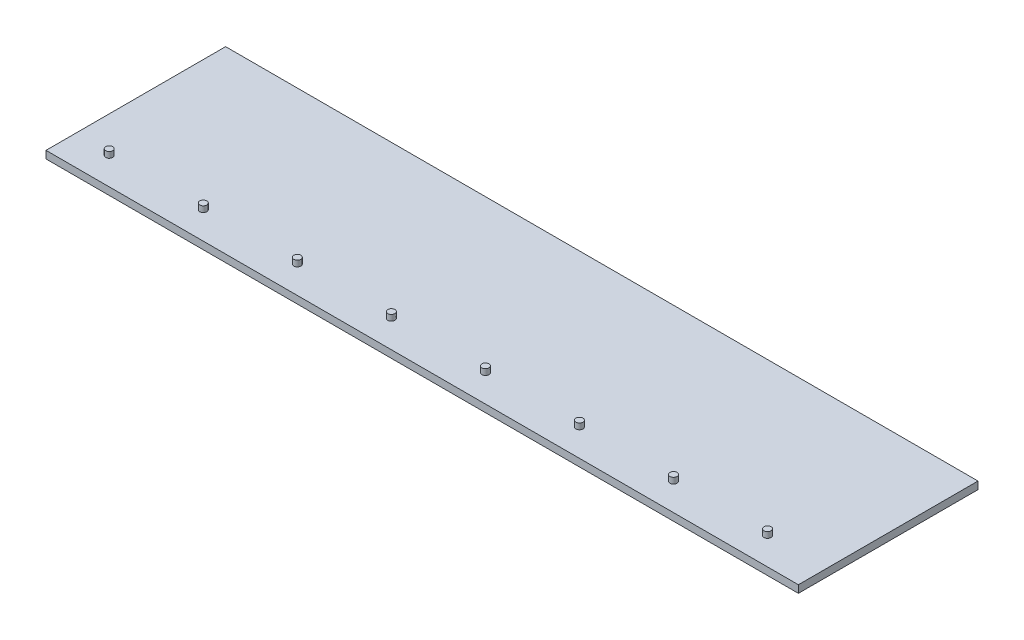
ISO-10303-21;
HEADER;
FILE_DESCRIPTION(('STEP AP214'),'2;1');
FILE_NAME('part.step','',(''),(''),'','','');
FILE_SCHEMA(('AUTOMOTIVE_DESIGN { 1 0 10303 214 1 1 1 1 }'));
ENDSEC;
DATA;
#1=APPLICATION_CONTEXT('core data for automotive mechanical design processes');
#2=APPLICATION_PROTOCOL_DEFINITION('international standard','automotive_design',2000,#1);
#3=PRODUCT_CONTEXT('',#1,'mechanical');
#4=PRODUCT('Part','Part','',(#3));
#5=PRODUCT_RELATED_PRODUCT_CATEGORY('part','',(#4));
#6=PRODUCT_DEFINITION_FORMATION('','',#4);
#7=PRODUCT_DEFINITION_CONTEXT('part definition',#1,'design');
#8=PRODUCT_DEFINITION('design','',#6,#7);
#9=PRODUCT_DEFINITION_SHAPE('','',#8);
#10=(LENGTH_UNIT() NAMED_UNIT(*) SI_UNIT(.MILLI.,.METRE.));
#11=(NAMED_UNIT(*) PLANE_ANGLE_UNIT() SI_UNIT($,.RADIAN.));
#12=(NAMED_UNIT(*) SI_UNIT($,.STERADIAN.) SOLID_ANGLE_UNIT());
#13=UNCERTAINTY_MEASURE_WITH_UNIT(LENGTH_MEASURE(1.E-05),#10,'distance_accuracy_value','');
#14=(GEOMETRIC_REPRESENTATION_CONTEXT(3) GLOBAL_UNCERTAINTY_ASSIGNED_CONTEXT((#13)) GLOBAL_UNIT_ASSIGNED_CONTEXT((#10,
#11,#12)) REPRESENTATION_CONTEXT('',''));
#15=CARTESIAN_POINT('',(0.,0.,0.));
#16=DIRECTION('',(0.,0.,1.));
#17=DIRECTION('',(1.,0.,0.));
#18=AXIS2_PLACEMENT_3D('',#15,#16,#17);
#19=CARTESIAN_POINT('',(147.284433720714,2.8321,-5.77122017290323));
#20=DIRECTION('',(0.,1.,0.));
#21=DIRECTION('',(0.,0.,1.));
#22=AXIS2_PLACEMENT_3D('',#19,#20,#21);
#23=PLANE('',#22);
#24=CARTESIAN_POINT('',(147.284433720714,2.8321,-5.77122017290323));
#25=DIRECTION('',(0.,1.,0.));
#26=DIRECTION('',(0.,0.,1.));
#27=AXIS2_PLACEMENT_3D('',#24,#25,#26);
#28=CIRCLE('',#27,0.75);
#29=CARTESIAN_POINT('',(147.284433720714,2.8321,-5.02122017290323));
#30=VERTEX_POINT('',#29);
#31=EDGE_CURVE('E11',#30,#30,#28,.T.);
#32=ORIENTED_EDGE('',*,*,#31,.T.);
#33=EDGE_LOOP('',(#32));
#34=FACE_BOUND('',#33,.T.);
#35=ADVANCED_FACE('F39',(#34),#23,.T.);
#36=CARTESIAN_POINT('',(147.284433720714,2.8321,-5.77122017290323));
#37=DIRECTION('',(0.,-1.,0.));
#38=DIRECTION('',(0.,0.,-1.));
#39=AXIS2_PLACEMENT_3D('',#36,#37,#38);
#40=CYLINDRICAL_SURFACE('',#39,0.75);
#41=ORIENTED_EDGE('',*,*,#31,.F.);
#42=EDGE_LOOP('',(#41));
#43=FACE_BOUND('',#42,.T.);
#44=CARTESIAN_POINT('',(147.284433720714,1.5875,-5.77122017290323));
#45=DIRECTION('',(0.,-1.,0.));
#46=DIRECTION('',(0.,0.,-1.));
#47=AXIS2_PLACEMENT_3D('',#44,#45,#46);
#48=CIRCLE('',#47,0.75);
#49=CARTESIAN_POINT('',(147.284433720714,1.5875,-6.52122017290323));
#50=VERTEX_POINT('',#49);
#51=EDGE_CURVE('E48',#50,#50,#48,.F.);
#52=ORIENTED_EDGE('',*,*,#51,.T.);
#53=EDGE_LOOP('',(#52));
#54=FACE_BOUND('',#53,.T.);
#55=ADVANCED_FACE('F180',(#43,#54),#40,.T.);
#56=CARTESIAN_POINT('',(127.335320370419,2.8321,-5.77122017290323));
#57=DIRECTION('',(0.,1.,0.));
#58=DIRECTION('',(0.,0.,1.));
#59=AXIS2_PLACEMENT_3D('',#56,#57,#58);
#60=PLANE('',#59);
#61=CARTESIAN_POINT('',(127.335320370419,2.8321,-5.77122017290323));
#62=DIRECTION('',(0.,1.,0.));
#63=DIRECTION('',(0.,0.,1.));
#64=AXIS2_PLACEMENT_3D('',#61,#62,#63);
#65=CIRCLE('',#64,0.75);
#66=CARTESIAN_POINT('',(127.335320370419,2.8321,-5.02122017290323));
#67=VERTEX_POINT('',#66);
#68=EDGE_CURVE('E173',#67,#67,#65,.T.);
#69=ORIENTED_EDGE('',*,*,#68,.T.);
#70=EDGE_LOOP('',(#69));
#71=FACE_BOUND('',#70,.T.);
#72=ADVANCED_FACE('F203',(#71),#60,.T.);
#73=CARTESIAN_POINT('',(127.335320370419,2.8321,-5.77122017290323));
#74=DIRECTION('',(0.,-1.,0.));
#75=DIRECTION('',(0.,0.,-1.));
#76=AXIS2_PLACEMENT_3D('',#73,#74,#75);
#77=CYLINDRICAL_SURFACE('',#76,0.75);
#78=ORIENTED_EDGE('',*,*,#68,.F.);
#79=EDGE_LOOP('',(#78));
#80=FACE_BOUND('',#79,.T.);
#81=CARTESIAN_POINT('',(127.335320370419,1.5875,-5.77122017290323));
#82=DIRECTION('',(0.,-1.,0.));
#83=DIRECTION('',(0.,0.,-1.));
#84=AXIS2_PLACEMENT_3D('',#81,#82,#83);
#85=CIRCLE('',#84,0.75);
#86=CARTESIAN_POINT('',(127.335320370419,1.5875,-6.52122017290323));
#87=VERTEX_POINT('',#86);
#88=EDGE_CURVE('E169',#87,#87,#85,.F.);
#89=ORIENTED_EDGE('',*,*,#88,.T.);
#90=EDGE_LOOP('',(#89));
#91=FACE_BOUND('',#90,.T.);
#92=ADVANCED_FACE('F209',(#80,#91),#77,.T.);
#93=CARTESIAN_POINT('',(107.386207020124,2.8321,-5.77122017290323));
#94=DIRECTION('',(0.,1.,0.));
#95=DIRECTION('',(0.,0.,1.));
#96=AXIS2_PLACEMENT_3D('',#93,#94,#95);
#97=PLANE('',#96);
#98=CARTESIAN_POINT('',(107.386207020124,2.8321,-5.77122017290323));
#99=DIRECTION('',(0.,1.,0.));
#100=DIRECTION('',(0.,0.,1.));
#101=AXIS2_PLACEMENT_3D('',#98,#99,#100);
#102=CIRCLE('',#101,0.75);
#103=CARTESIAN_POINT('',(107.386207020124,2.8321,-5.02122017290323));
#104=VERTEX_POINT('',#103);
#105=EDGE_CURVE('E165',#104,#104,#102,.T.);
#106=ORIENTED_EDGE('',*,*,#105,.T.);
#107=EDGE_LOOP('',(#106));
#108=FACE_BOUND('',#107,.T.);
#109=ADVANCED_FACE('F215',(#108),#97,.T.);
#110=CARTESIAN_POINT('',(107.386207020124,2.8321,-5.77122017290323));
#111=DIRECTION('',(0.,-1.,0.));
#112=DIRECTION('',(0.,0.,-1.));
#113=AXIS2_PLACEMENT_3D('',#110,#111,#112);
#114=CYLINDRICAL_SURFACE('',#113,0.75);
#115=ORIENTED_EDGE('',*,*,#105,.F.);
#116=EDGE_LOOP('',(#115));
#117=FACE_BOUND('',#116,.T.);
#118=CARTESIAN_POINT('',(107.386207020124,1.5875,-5.77122017290323));
#119=DIRECTION('',(0.,-1.,0.));
#120=DIRECTION('',(0.,0.,-1.));
#121=AXIS2_PLACEMENT_3D('',#118,#119,#120);
#122=CIRCLE('',#121,0.75);
#123=CARTESIAN_POINT('',(107.386207020124,1.5875,-6.52122017290323));
#124=VERTEX_POINT('',#123);
#125=EDGE_CURVE('E161',#124,#124,#122,.F.);
#126=ORIENTED_EDGE('',*,*,#125,.T.);
#127=EDGE_LOOP('',(#126));
#128=FACE_BOUND('',#127,.T.);
#129=ADVANCED_FACE('F219',(#117,#128),#114,.T.);
#130=CARTESIAN_POINT('',(87.4370936698287,2.8321,-5.77122017290323));
#131=DIRECTION('',(0.,1.,0.));
#132=DIRECTION('',(0.,0.,1.));
#133=AXIS2_PLACEMENT_3D('',#130,#131,#132);
#134=PLANE('',#133);
#135=CARTESIAN_POINT('',(87.4370936698287,2.8321,-5.77122017290323));
#136=DIRECTION('',(0.,1.,0.));
#137=DIRECTION('',(0.,0.,1.));
#138=AXIS2_PLACEMENT_3D('',#135,#136,#137);
#139=CIRCLE('',#138,0.75);
#140=CARTESIAN_POINT('',(87.4370936698287,2.8321,-5.02122017290323));
#141=VERTEX_POINT('',#140);
#142=EDGE_CURVE('E157',#141,#141,#139,.T.);
#143=ORIENTED_EDGE('',*,*,#142,.T.);
#144=EDGE_LOOP('',(#143));
#145=FACE_BOUND('',#144,.T.);
#146=ADVANCED_FACE('F223',(#145),#134,.T.);
#147=CARTESIAN_POINT('',(87.4370936698287,2.8321,-5.77122017290323));
#148=DIRECTION('',(0.,-1.,0.));
#149=DIRECTION('',(0.,0.,-1.));
#150=AXIS2_PLACEMENT_3D('',#147,#148,#149);
#151=CYLINDRICAL_SURFACE('',#150,0.75);
#152=ORIENTED_EDGE('',*,*,#142,.F.);
#153=EDGE_LOOP('',(#152));
#154=FACE_BOUND('',#153,.T.);
#155=CARTESIAN_POINT('',(87.4370936698287,1.5875,-5.77122017290323));
#156=DIRECTION('',(0.,-1.,0.));
#157=DIRECTION('',(0.,0.,-1.));
#158=AXIS2_PLACEMENT_3D('',#155,#156,#157);
#159=CIRCLE('',#158,0.75);
#160=CARTESIAN_POINT('',(87.4370936698287,1.5875,-6.52122017290323));
#161=VERTEX_POINT('',#160);
#162=EDGE_CURVE('E153',#161,#161,#159,.F.);
#163=ORIENTED_EDGE('',*,*,#162,.T.);
#164=EDGE_LOOP('',(#163));
#165=FACE_BOUND('',#164,.T.);
#166=ADVANCED_FACE('F227',(#154,#165),#151,.T.);
#167=CARTESIAN_POINT('',(67.4879803195335,2.8321,-5.77122017290323));
#168=DIRECTION('',(0.,1.,0.));
#169=DIRECTION('',(0.,0.,1.));
#170=AXIS2_PLACEMENT_3D('',#167,#168,#169);
#171=PLANE('',#170);
#172=CARTESIAN_POINT('',(67.4879803195335,2.8321,-5.77122017290323));
#173=DIRECTION('',(0.,1.,0.));
#174=DIRECTION('',(0.,0.,1.));
#175=AXIS2_PLACEMENT_3D('',#172,#173,#174);
#176=CIRCLE('',#175,0.75);
#177=CARTESIAN_POINT('',(67.4879803195335,2.8321,-5.02122017290323));
#178=VERTEX_POINT('',#177);
#179=EDGE_CURVE('E149',#178,#178,#176,.T.);
#180=ORIENTED_EDGE('',*,*,#179,.T.);
#181=EDGE_LOOP('',(#180));
#182=FACE_BOUND('',#181,.T.);
#183=ADVANCED_FACE('F231',(#182),#171,.T.);
#184=CARTESIAN_POINT('',(67.4879803195335,2.8321,-5.77122017290323));
#185=DIRECTION('',(0.,-1.,0.));
#186=DIRECTION('',(0.,0.,-1.));
#187=AXIS2_PLACEMENT_3D('',#184,#185,#186);
#188=CYLINDRICAL_SURFACE('',#187,0.75);
#189=ORIENTED_EDGE('',*,*,#179,.F.);
#190=EDGE_LOOP('',(#189));
#191=FACE_BOUND('',#190,.T.);
#192=CARTESIAN_POINT('',(67.4879803195335,1.5875,-5.77122017290323));
#193=DIRECTION('',(0.,-1.,0.));
#194=DIRECTION('',(0.,0.,-1.));
#195=AXIS2_PLACEMENT_3D('',#192,#193,#194);
#196=CIRCLE('',#195,0.75);
#197=CARTESIAN_POINT('',(67.4879803195335,1.5875,-6.52122017290323));
#198=VERTEX_POINT('',#197);
#199=EDGE_CURVE('E145',#198,#198,#196,.F.);
#200=ORIENTED_EDGE('',*,*,#199,.T.);
#201=EDGE_LOOP('',(#200));
#202=FACE_BOUND('',#201,.T.);
#203=ADVANCED_FACE('F235',(#191,#202),#188,.T.);
#204=CARTESIAN_POINT('',(47.5388669692384,2.8321,-5.77122017290323));
#205=DIRECTION('',(0.,1.,0.));
#206=DIRECTION('',(0.,0.,1.));
#207=AXIS2_PLACEMENT_3D('',#204,#205,#206);
#208=PLANE('',#207);
#209=CARTESIAN_POINT('',(47.5388669692384,2.8321,-5.77122017290323));
#210=DIRECTION('',(0.,1.,0.));
#211=DIRECTION('',(0.,0.,1.));
#212=AXIS2_PLACEMENT_3D('',#209,#210,#211);
#213=CIRCLE('',#212,0.75);
#214=CARTESIAN_POINT('',(47.5388669692384,2.8321,-5.02122017290323));
#215=VERTEX_POINT('',#214);
#216=EDGE_CURVE('E141',#215,#215,#213,.T.);
#217=ORIENTED_EDGE('',*,*,#216,.T.);
#218=EDGE_LOOP('',(#217));
#219=FACE_BOUND('',#218,.T.);
#220=ADVANCED_FACE('F239',(#219),#208,.T.);
#221=CARTESIAN_POINT('',(47.5388669692384,2.8321,-5.77122017290323));
#222=DIRECTION('',(0.,-1.,0.));
#223=DIRECTION('',(0.,0.,-1.));
#224=AXIS2_PLACEMENT_3D('',#221,#222,#223);
#225=CYLINDRICAL_SURFACE('',#224,0.75);
#226=ORIENTED_EDGE('',*,*,#216,.F.);
#227=EDGE_LOOP('',(#226));
#228=FACE_BOUND('',#227,.T.);
#229=CARTESIAN_POINT('',(47.5388669692384,1.5875,-5.77122017290323));
#230=DIRECTION('',(0.,-1.,0.));
#231=DIRECTION('',(0.,0.,-1.));
#232=AXIS2_PLACEMENT_3D('',#229,#230,#231);
#233=CIRCLE('',#232,0.75);
#234=CARTESIAN_POINT('',(47.5388669692384,1.5875,-6.52122017290323));
#235=VERTEX_POINT('',#234);
#236=EDGE_CURVE('E137',#235,#235,#233,.F.);
#237=ORIENTED_EDGE('',*,*,#236,.T.);
#238=EDGE_LOOP('',(#237));
#239=FACE_BOUND('',#238,.T.);
#240=ADVANCED_FACE('F243',(#228,#239),#225,.T.);
#241=CARTESIAN_POINT('',(0.,1.5875,0.));
#242=DIRECTION('',(1.,0.,0.));
#243=DIRECTION('',(0.,0.,-1.));
#244=AXIS2_PLACEMENT_3D('',#241,#242,#243);
#245=PLANE('',#244);
#246=DIRECTION('',(0.,0.,1.));
#247=VECTOR('',#246,1.);
#248=CARTESIAN_POINT('',(0.,0.,0.));
#249=LINE('',#248,#247);
#250=CARTESIAN_POINT('',(0.,0.,-38.1));
#251=VERTEX_POINT('',#250);
#252=CARTESIAN_POINT('',(0.,0.,0.));
#253=VERTEX_POINT('',#252);
#254=EDGE_CURVE('E112',#251,#253,#249,.T.);
#255=ORIENTED_EDGE('',*,*,#254,.T.);
#256=DIRECTION('',(0.,-1.,0.));
#257=VECTOR('',#256,1.);
#258=CARTESIAN_POINT('',(0.,1.5875,0.));
#259=LINE('',#258,#257);
#260=CARTESIAN_POINT('',(0.,1.5875,0.));
#261=VERTEX_POINT('',#260);
#262=EDGE_CURVE('E101',#261,#253,#259,.T.);
#263=ORIENTED_EDGE('',*,*,#262,.F.);
#264=DIRECTION('',(0.,0.,1.));
#265=VECTOR('',#264,1.);
#266=CARTESIAN_POINT('',(0.,1.5875,0.));
#267=LINE('',#266,#265);
#268=CARTESIAN_POINT('',(0.,1.5875,-38.1));
#269=VERTEX_POINT('',#268);
#270=EDGE_CURVE('E93',#269,#261,#267,.T.);
#271=ORIENTED_EDGE('',*,*,#270,.F.);
#272=DIRECTION('',(0.,-1.,0.));
#273=VECTOR('',#272,1.);
#274=CARTESIAN_POINT('',(0.,1.5875,-38.1));
#275=LINE('',#274,#273);
#276=EDGE_CURVE('E108',#269,#251,#275,.T.);
#277=ORIENTED_EDGE('',*,*,#276,.T.);
#278=EDGE_LOOP('',(#255,#263,#271,#277));
#279=FACE_BOUND('',#278,.T.);
#280=ADVANCED_FACE('F247',(#279),#245,.F.);
#281=CARTESIAN_POINT('',(0.,1.5875,0.));
#282=DIRECTION('',(0.,0.,-1.));
#283=DIRECTION('',(-1.,0.,0.));
#284=AXIS2_PLACEMENT_3D('',#281,#282,#283);
#285=PLANE('',#284);
#286=DIRECTION('',(1.,0.,0.));
#287=VECTOR('',#286,1.);
#288=CARTESIAN_POINT('',(0.,0.,0.));
#289=LINE('',#288,#287);
#290=CARTESIAN_POINT('',(159.592906802361,0.,0.));
#291=VERTEX_POINT('',#290);
#292=EDGE_CURVE('E99',#253,#291,#289,.T.);
#293=ORIENTED_EDGE('',*,*,#292,.T.);
#294=DIRECTION('',(0.,-1.,0.));
#295=VECTOR('',#294,1.);
#296=CARTESIAN_POINT('',(159.592906802361,1.5875,0.));
#297=LINE('',#296,#295);
#298=CARTESIAN_POINT('',(159.592906802361,1.5875,0.));
#299=VERTEX_POINT('',#298);
#300=EDGE_CURVE('E97',#299,#291,#297,.T.);
#301=ORIENTED_EDGE('',*,*,#300,.F.);
#302=DIRECTION('',(1.,0.,0.));
#303=VECTOR('',#302,1.);
#304=CARTESIAN_POINT('',(0.,1.5875,0.));
#305=LINE('',#304,#303);
#306=EDGE_CURVE('E87',#261,#299,#305,.T.);
#307=ORIENTED_EDGE('',*,*,#306,.F.);
#308=ORIENTED_EDGE('',*,*,#262,.T.);
#309=EDGE_LOOP('',(#293,#301,#307,#308));
#310=FACE_BOUND('',#309,.T.);
#311=ADVANCED_FACE('F98',(#310),#285,.F.);
#312=CARTESIAN_POINT('',(159.592906802361,1.5875,0.));
#313=DIRECTION('',(-1.,0.,0.));
#314=DIRECTION('',(0.,0.,1.));
#315=AXIS2_PLACEMENT_3D('',#312,#313,#314);
#316=PLANE('',#315);
#317=DIRECTION('',(0.,0.,-1.));
#318=VECTOR('',#317,1.);
#319=CARTESIAN_POINT('',(159.592906802361,0.,0.));
#320=LINE('',#319,#318);
#321=CARTESIAN_POINT('',(159.592906802361,0.,-38.1));
#322=VERTEX_POINT('',#321);
#323=EDGE_CURVE('E73',#291,#322,#320,.T.);
#324=ORIENTED_EDGE('',*,*,#323,.T.);
#325=DIRECTION('',(0.,-1.,0.));
#326=VECTOR('',#325,1.);
#327=CARTESIAN_POINT('',(159.592906802361,1.5875,-38.1));
#328=LINE('',#327,#326);
#329=CARTESIAN_POINT('',(159.592906802361,1.5875,-38.1));
#330=VERTEX_POINT('',#329);
#331=EDGE_CURVE('E102',#330,#322,#328,.T.);
#332=ORIENTED_EDGE('',*,*,#331,.F.);
#333=DIRECTION('',(0.,0.,-1.));
#334=VECTOR('',#333,1.);
#335=CARTESIAN_POINT('',(159.592906802361,1.5875,0.));
#336=LINE('',#335,#334);
#337=EDGE_CURVE('E91',#299,#330,#336,.T.);
#338=ORIENTED_EDGE('',*,*,#337,.F.);
#339=ORIENTED_EDGE('',*,*,#300,.T.);
#340=EDGE_LOOP('',(#324,#332,#338,#339));
#341=FACE_BOUND('',#340,.T.);
#342=ADVANCED_FACE('F104',(#341),#316,.F.);
#343=CARTESIAN_POINT('',(0.,1.5875,-38.1));
#344=DIRECTION('',(0.,0.,1.));
#345=DIRECTION('',(1.,0.,0.));
#346=AXIS2_PLACEMENT_3D('',#343,#344,#345);
#347=PLANE('',#346);
#348=DIRECTION('',(-1.,0.,0.));
#349=VECTOR('',#348,1.);
#350=CARTESIAN_POINT('',(0.,0.,-38.1));
#351=LINE('',#350,#349);
#352=EDGE_CURVE('E79',#322,#251,#351,.T.);
#353=ORIENTED_EDGE('',*,*,#352,.T.);
#354=ORIENTED_EDGE('',*,*,#276,.F.);
#355=DIRECTION('',(-1.,0.,0.));
#356=VECTOR('',#355,1.);
#357=CARTESIAN_POINT('',(0.,1.5875,-38.1));
#358=LINE('',#357,#356);
#359=EDGE_CURVE('E56',#330,#269,#358,.T.);
#360=ORIENTED_EDGE('',*,*,#359,.F.);
#361=ORIENTED_EDGE('',*,*,#331,.T.);
#362=EDGE_LOOP('',(#353,#354,#360,#361));
#363=FACE_BOUND('',#362,.T.);
#364=ADVANCED_FACE('F184',(#363),#347,.F.);
#365=CARTESIAN_POINT('',(0.,1.5875,0.));
#366=DIRECTION('',(0.,-1.,0.));
#367=DIRECTION('',(0.,0.,-1.));
#368=AXIS2_PLACEMENT_3D('',#365,#366,#367);
#369=PLANE('',#368);
#370=CARTESIAN_POINT('',(27.5897536189432,1.5875,-5.77122017290323));
#371=DIRECTION('',(0.,-1.,0.));
#372=DIRECTION('',(0.,0.,-1.));
#373=AXIS2_PLACEMENT_3D('',#370,#371,#372);
#374=CIRCLE('',#373,0.75);
#375=CARTESIAN_POINT('',(27.5897536189432,1.5875,-6.52122017290323));
#376=VERTEX_POINT('',#375);
#377=EDGE_CURVE('E133',#376,#376,#374,.F.);
#378=ORIENTED_EDGE('',*,*,#377,.F.);
#379=EDGE_LOOP('',(#378));
#380=FACE_BOUND('',#379,.T.);
#381=CARTESIAN_POINT('',(7.64064026864799,1.5875,-5.77122017290323));
#382=DIRECTION('',(0.,-1.,0.));
#383=DIRECTION('',(0.,0.,-1.));
#384=AXIS2_PLACEMENT_3D('',#381,#382,#383);
#385=CIRCLE('',#384,0.75);
#386=CARTESIAN_POINT('',(7.64064026864799,1.5875,-6.52122017290323));
#387=VERTEX_POINT('',#386);
#388=EDGE_CURVE('E129',#387,#387,#385,.F.);
#389=ORIENTED_EDGE('',*,*,#388,.F.);
#390=EDGE_LOOP('',(#389));
#391=FACE_BOUND('',#390,.T.);
#392=ORIENTED_EDGE('',*,*,#270,.T.);
#393=ORIENTED_EDGE('',*,*,#306,.T.);
#394=ORIENTED_EDGE('',*,*,#337,.T.);
#395=ORIENTED_EDGE('',*,*,#359,.T.);
#396=EDGE_LOOP('',(#392,#393,#394,#395));
#397=FACE_BOUND('',#396,.T.);
#398=ORIENTED_EDGE('',*,*,#236,.F.);
#399=EDGE_LOOP('',(#398));
#400=FACE_BOUND('',#399,.T.);
#401=ORIENTED_EDGE('',*,*,#199,.F.);
#402=EDGE_LOOP('',(#401));
#403=FACE_BOUND('',#402,.T.);
#404=ORIENTED_EDGE('',*,*,#162,.F.);
#405=EDGE_LOOP('',(#404));
#406=FACE_BOUND('',#405,.T.);
#407=ORIENTED_EDGE('',*,*,#125,.F.);
#408=EDGE_LOOP('',(#407));
#409=FACE_BOUND('',#408,.T.);
#410=ORIENTED_EDGE('',*,*,#88,.F.);
#411=EDGE_LOOP('',(#410));
#412=FACE_BOUND('',#411,.T.);
#413=ORIENTED_EDGE('',*,*,#51,.F.);
#414=EDGE_LOOP('',(#413));
#415=FACE_BOUND('',#414,.T.);
#416=ADVANCED_FACE('F88',(#380,#391,#397,#400,#403,#406,#409,#412,#415),#369,.F.);
#417=CARTESIAN_POINT('',(0.,0.,0.));
#418=DIRECTION('',(0.,-1.,0.));
#419=DIRECTION('',(0.,0.,-1.));
#420=AXIS2_PLACEMENT_3D('',#417,#418,#419);
#421=PLANE('',#420);
#422=ORIENTED_EDGE('',*,*,#254,.F.);
#423=ORIENTED_EDGE('',*,*,#352,.F.);
#424=ORIENTED_EDGE('',*,*,#323,.F.);
#425=ORIENTED_EDGE('',*,*,#292,.F.);
#426=EDGE_LOOP('',(#422,#423,#424,#425));
#427=FACE_BOUND('',#426,.T.);
#428=ADVANCED_FACE('F183',(#427),#421,.T.);
#429=CARTESIAN_POINT('',(7.64064026864799,2.8321,-5.77122017290323));
#430=DIRECTION('',(0.,-1.,0.));
#431=DIRECTION('',(0.,0.,-1.));
#432=AXIS2_PLACEMENT_3D('',#429,#430,#431);
#433=CYLINDRICAL_SURFACE('',#432,0.75);
#434=CARTESIAN_POINT('',(7.64064026864799,2.8321,-5.77122017290323));
#435=DIRECTION('',(0.,1.,0.));
#436=DIRECTION('',(0.,0.,1.));
#437=AXIS2_PLACEMENT_3D('',#434,#435,#436);
#438=CIRCLE('',#437,0.75);
#439=CARTESIAN_POINT('',(7.64064026864799,2.8321,-5.02122017290323));
#440=VERTEX_POINT('',#439);
#441=EDGE_CURVE('E116',#440,#440,#438,.T.);
#442=ORIENTED_EDGE('',*,*,#441,.F.);
#443=EDGE_LOOP('',(#442));
#444=FACE_BOUND('',#443,.T.);
#445=ORIENTED_EDGE('',*,*,#388,.T.);
#446=EDGE_LOOP('',(#445));
#447=FACE_BOUND('',#446,.T.);
#448=ADVANCED_FACE('F191',(#444,#447),#433,.T.);
#449=CARTESIAN_POINT('',(7.64064026864799,2.8321,-5.77122017290323));
#450=DIRECTION('',(0.,1.,0.));
#451=DIRECTION('',(0.,0.,1.));
#452=AXIS2_PLACEMENT_3D('',#449,#450,#451);
#453=PLANE('',#452);
#454=ORIENTED_EDGE('',*,*,#441,.T.);
#455=EDGE_LOOP('',(#454));
#456=FACE_BOUND('',#455,.T.);
#457=ADVANCED_FACE('F279',(#456),#453,.T.);
#458=CARTESIAN_POINT('',(27.5897536189432,2.8321,-5.77122017290323));
#459=DIRECTION('',(0.,-1.,0.));
#460=DIRECTION('',(0.,0.,-1.));
#461=AXIS2_PLACEMENT_3D('',#458,#459,#460);
#462=CYLINDRICAL_SURFACE('',#461,0.75);
#463=CARTESIAN_POINT('',(27.5897536189432,2.8321,-5.77122017290323));
#464=DIRECTION('',(0.,1.,0.));
#465=DIRECTION('',(0.,0.,1.));
#466=AXIS2_PLACEMENT_3D('',#463,#464,#465);
#467=CIRCLE('',#466,0.75);
#468=CARTESIAN_POINT('',(27.5897536189432,2.8321,-5.02122017290323));
#469=VERTEX_POINT('',#468);
#470=EDGE_CURVE('E385',#469,#469,#467,.T.);
#471=ORIENTED_EDGE('',*,*,#470,.F.);
#472=EDGE_LOOP('',(#471));
#473=FACE_BOUND('',#472,.T.);
#474=ORIENTED_EDGE('',*,*,#377,.T.);
#475=EDGE_LOOP('',(#474));
#476=FACE_BOUND('',#475,.T.);
#477=ADVANCED_FACE('F287',(#473,#476),#462,.T.);
#478=CARTESIAN_POINT('',(27.5897536189432,2.8321,-5.77122017290323));
#479=DIRECTION('',(0.,1.,0.));
#480=DIRECTION('',(0.,0.,1.));
#481=AXIS2_PLACEMENT_3D('',#478,#479,#480);
#482=PLANE('',#481);
#483=ORIENTED_EDGE('',*,*,#470,.T.);
#484=EDGE_LOOP('',(#483));
#485=FACE_BOUND('',#484,.T.);
#486=ADVANCED_FACE('F369',(#485),#482,.T.);
#487=CLOSED_SHELL('',(#35,#55,#72,#92,#109,#129,#146,#166,#183,#203,#220,#240,#280,#311,#342,
#364,#416,#428,#448,#457,#477,#486));
#488=MANIFOLD_SOLID_BREP('B2',#487);
#489=ADVANCED_BREP_SHAPE_REPRESENTATION('',(#18,#488),#14);
#490=SHAPE_DEFINITION_REPRESENTATION(#9,#489);
ENDSEC;
END-ISO-10303-21;
